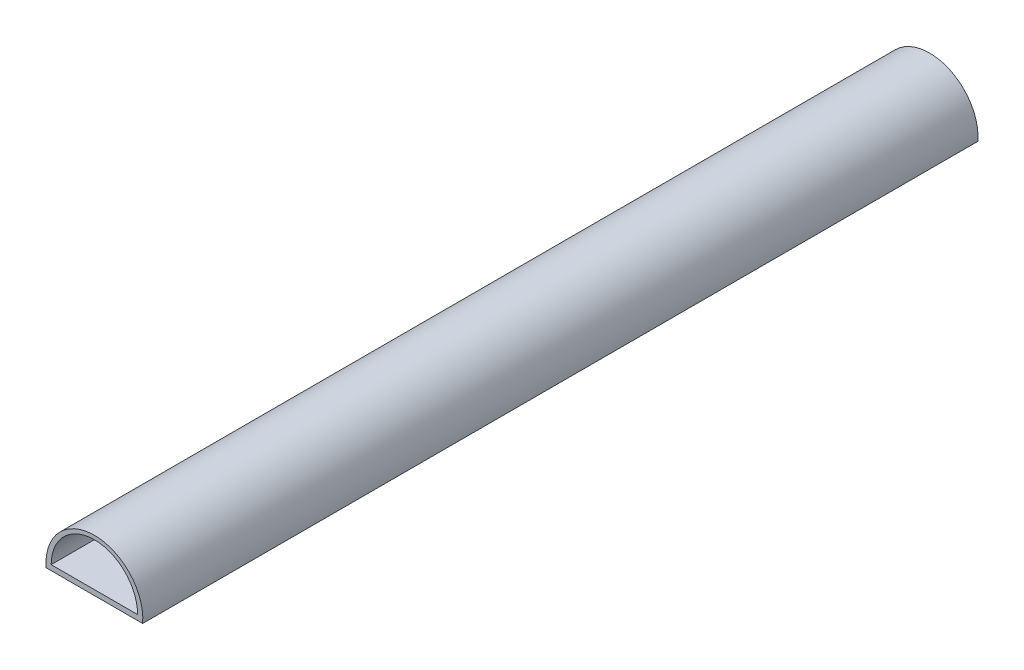
ISO-10303-21;
HEADER;
FILE_DESCRIPTION(('STEP AP214'),'2;1');
FILE_NAME('part.step','',(''),(''),'','','');
FILE_SCHEMA(('AUTOMOTIVE_DESIGN { 1 0 10303 214 1 1 1 1 }'));
ENDSEC;
DATA;
#1=APPLICATION_CONTEXT('core data for automotive mechanical design processes');
#2=APPLICATION_PROTOCOL_DEFINITION('international standard','automotive_design',2000,#1);
#3=PRODUCT_CONTEXT('',#1,'mechanical');
#4=PRODUCT('Part','Part','',(#3));
#5=PRODUCT_RELATED_PRODUCT_CATEGORY('part','',(#4));
#6=PRODUCT_DEFINITION_FORMATION('','',#4);
#7=PRODUCT_DEFINITION_CONTEXT('part definition',#1,'design');
#8=PRODUCT_DEFINITION('design','',#6,#7);
#9=PRODUCT_DEFINITION_SHAPE('','',#8);
#10=(LENGTH_UNIT() NAMED_UNIT(*) SI_UNIT(.MILLI.,.METRE.));
#11=(NAMED_UNIT(*) PLANE_ANGLE_UNIT() SI_UNIT($,.RADIAN.));
#12=(NAMED_UNIT(*) SI_UNIT($,.STERADIAN.) SOLID_ANGLE_UNIT());
#13=UNCERTAINTY_MEASURE_WITH_UNIT(LENGTH_MEASURE(1.E-05),#10,'distance_accuracy_value','');
#14=(GEOMETRIC_REPRESENTATION_CONTEXT(3) GLOBAL_UNCERTAINTY_ASSIGNED_CONTEXT((#13)) GLOBAL_UNIT_ASSIGNED_CONTEXT((#10,
#11,#12)) REPRESENTATION_CONTEXT('',''));
#15=CARTESIAN_POINT('',(0.,0.,0.));
#16=DIRECTION('',(0.,0.,1.));
#17=DIRECTION('',(1.,0.,0.));
#18=AXIS2_PLACEMENT_3D('',#15,#16,#17);
#19=CARTESIAN_POINT('',(-8.42700279293845,-8.87685553456328,254.));
#20=DIRECTION('',(0.,0.,-1.));
#21=DIRECTION('',(-1.,0.,0.));
#22=AXIS2_PLACEMENT_3D('',#19,#20,#21);
#23=PLANE('',#22);
#24=CARTESIAN_POINT('',(-8.42700279293845,-8.87685553456328,254.));
#25=DIRECTION('',(0.,0.,1.));
#26=DIRECTION('',(-1.,0.,0.));
#27=AXIS2_PLACEMENT_3D('',#24,#25,#26);
#28=CIRCLE('',#27,14.7310367744908);
#29=CARTESIAN_POINT('',(6.25737220706155,-10.0484251273645,254.));
#30=VERTEX_POINT('',#29);
#31=CARTESIAN_POINT('',(-23.1113777929385,-10.0484251273645,254.));
#32=VERTEX_POINT('',#31);
#33=EDGE_CURVE('E103',#30,#32,#28,.T.);
#34=ORIENTED_EDGE('',*,*,#33,.T.);
#35=DIRECTION('',(1.,0.,0.));
#36=VECTOR('',#35,1.);
#37=CARTESIAN_POINT('',(-23.1113777929385,-10.0484251273645,254.));
#38=LINE('',#37,#36);
#39=EDGE_CURVE('E107',#32,#30,#38,.T.);
#40=ORIENTED_EDGE('',*,*,#39,.T.);
#41=EDGE_LOOP('',(#34,#40));
#42=FACE_BOUND('',#41,.T.);
#43=CARTESIAN_POINT('',(-8.42700279293845,-8.46092512736455,254.));
#44=DIRECTION('',(0.,0.,1.));
#45=DIRECTION('',(-1.,0.,0.));
#46=AXIS2_PLACEMENT_3D('',#43,#44,#45);
#47=CIRCLE('',#46,13.1445);
#48=CARTESIAN_POINT('',(4.71749720706154,-8.46092512736455,254.));
#49=VERTEX_POINT('',#48);
#50=CARTESIAN_POINT('',(-21.5715027929384,-8.46092512736455,254.));
#51=VERTEX_POINT('',#50);
#52=EDGE_CURVE('E83',#49,#51,#47,.T.);
#53=ORIENTED_EDGE('',*,*,#52,.F.);
#54=DIRECTION('',(1.,0.,0.));
#55=VECTOR('',#54,1.);
#56=CARTESIAN_POINT('',(-8.42700279293845,-8.46092512736455,254.));
#57=LINE('',#56,#55);
#58=EDGE_CURVE('E78',#51,#49,#57,.T.);
#59=ORIENTED_EDGE('',*,*,#58,.F.);
#60=EDGE_LOOP('',(#53,#59));
#61=FACE_BOUND('',#60,.T.);
#62=ADVANCED_FACE('F39',(#42,#61),#23,.F.);
#63=CARTESIAN_POINT('',(-8.42700279293845,-8.87685553456328,0.));
#64=DIRECTION('',(0.,0.,-1.));
#65=DIRECTION('',(-1.,0.,0.));
#66=AXIS2_PLACEMENT_3D('',#63,#64,#65);
#67=PLANE('',#66);
#68=CARTESIAN_POINT('',(-8.42700279293845,-8.87685553456328,0.));
#69=DIRECTION('',(0.,0.,1.));
#70=DIRECTION('',(-1.,0.,0.));
#71=AXIS2_PLACEMENT_3D('',#68,#69,#70);
#72=CIRCLE('',#71,14.7310367744908);
#73=CARTESIAN_POINT('',(6.25737220706155,-10.0484251273645,0.));
#74=VERTEX_POINT('',#73);
#75=CARTESIAN_POINT('',(-23.1113777929385,-10.0484251273645,0.));
#76=VERTEX_POINT('',#75);
#77=EDGE_CURVE('E92',#74,#76,#72,.T.);
#78=ORIENTED_EDGE('',*,*,#77,.F.);
#79=DIRECTION('',(1.,0.,0.));
#80=VECTOR('',#79,1.);
#81=CARTESIAN_POINT('',(-23.1113777929385,-10.0484251273645,0.));
#82=LINE('',#81,#80);
#83=EDGE_CURVE('E108',#76,#74,#82,.T.);
#84=ORIENTED_EDGE('',*,*,#83,.F.);
#85=EDGE_LOOP('',(#78,#84));
#86=FACE_BOUND('',#85,.T.);
#87=DIRECTION('',(1.,0.,0.));
#88=VECTOR('',#87,1.);
#89=CARTESIAN_POINT('',(-8.42700279293845,-8.46092512736455,0.));
#90=LINE('',#89,#88);
#91=CARTESIAN_POINT('',(-21.5715027929384,-8.46092512736455,0.));
#92=VERTEX_POINT('',#91);
#93=CARTESIAN_POINT('',(4.71749720706154,-8.46092512736455,0.));
#94=VERTEX_POINT('',#93);
#95=EDGE_CURVE('E84',#92,#94,#90,.T.);
#96=ORIENTED_EDGE('',*,*,#95,.T.);
#97=CARTESIAN_POINT('',(-8.42700279293845,-8.46092512736455,0.));
#98=DIRECTION('',(0.,0.,1.));
#99=DIRECTION('',(-1.,0.,0.));
#100=AXIS2_PLACEMENT_3D('',#97,#98,#99);
#101=CIRCLE('',#100,13.1445);
#102=EDGE_CURVE('E89',#94,#92,#101,.T.);
#103=ORIENTED_EDGE('',*,*,#102,.T.);
#104=EDGE_LOOP('',(#96,#103));
#105=FACE_BOUND('',#104,.T.);
#106=ADVANCED_FACE('F124',(#86,#105),#67,.T.);
#107=CARTESIAN_POINT('',(-8.42700279293845,-8.87685553456328,254.));
#108=DIRECTION('',(0.,0.,-1.));
#109=DIRECTION('',(-1.,0.,0.));
#110=AXIS2_PLACEMENT_3D('',#107,#108,#109);
#111=CYLINDRICAL_SURFACE('',#110,14.7310367744908);
#112=ORIENTED_EDGE('',*,*,#77,.T.);
#113=DIRECTION('',(0.,0.,-1.));
#114=VECTOR('',#113,1.);
#115=CARTESIAN_POINT('',(-23.1113777929385,-10.0484251273645,254.));
#116=LINE('',#115,#114);
#117=EDGE_CURVE('E11',#32,#76,#116,.T.);
#118=ORIENTED_EDGE('',*,*,#117,.F.);
#119=ORIENTED_EDGE('',*,*,#33,.F.);
#120=DIRECTION('',(0.,0.,-1.));
#121=VECTOR('',#120,1.);
#122=CARTESIAN_POINT('',(6.25737220706155,-10.0484251273645,254.));
#123=LINE('',#122,#121);
#124=EDGE_CURVE('E48',#30,#74,#123,.T.);
#125=ORIENTED_EDGE('',*,*,#124,.T.);
#126=EDGE_LOOP('',(#112,#118,#119,#125));
#127=FACE_BOUND('',#126,.T.);
#128=ADVANCED_FACE('F41',(#127),#111,.T.);
#129=CARTESIAN_POINT('',(-23.1113777929385,-10.0484251273645,254.));
#130=DIRECTION('',(0.,1.,0.));
#131=DIRECTION('',(0.,0.,1.));
#132=AXIS2_PLACEMENT_3D('',#129,#130,#131);
#133=PLANE('',#132);
#134=ORIENTED_EDGE('',*,*,#83,.T.);
#135=ORIENTED_EDGE('',*,*,#124,.F.);
#136=ORIENTED_EDGE('',*,*,#39,.F.);
#137=ORIENTED_EDGE('',*,*,#117,.T.);
#138=EDGE_LOOP('',(#134,#135,#136,#137));
#139=FACE_BOUND('',#138,.T.);
#140=ADVANCED_FACE('F126',(#139),#133,.F.);
#141=CARTESIAN_POINT('',(-8.42700279293845,-8.46092512736455,254.));
#142=DIRECTION('',(0.,0.,-1.));
#143=DIRECTION('',(-1.,0.,0.));
#144=AXIS2_PLACEMENT_3D('',#141,#142,#143);
#145=CYLINDRICAL_SURFACE('',#144,13.1445);
#146=ORIENTED_EDGE('',*,*,#102,.F.);
#147=DIRECTION('',(0.,0.,-1.));
#148=VECTOR('',#147,1.);
#149=CARTESIAN_POINT('',(4.71749720706154,-8.46092512736455,254.));
#150=LINE('',#149,#148);
#151=EDGE_CURVE('E60',#49,#94,#150,.T.);
#152=ORIENTED_EDGE('',*,*,#151,.F.);
#153=ORIENTED_EDGE('',*,*,#52,.T.);
#154=DIRECTION('',(0.,0.,-1.));
#155=VECTOR('',#154,1.);
#156=CARTESIAN_POINT('',(-21.5715027929384,-8.46092512736455,254.));
#157=LINE('',#156,#155);
#158=EDGE_CURVE('E55',#51,#92,#157,.T.);
#159=ORIENTED_EDGE('',*,*,#158,.T.);
#160=EDGE_LOOP('',(#146,#152,#153,#159));
#161=FACE_BOUND('',#160,.T.);
#162=ADVANCED_FACE('F87',(#161),#145,.F.);
#163=CARTESIAN_POINT('',(-8.42700279293845,-8.46092512736455,254.));
#164=DIRECTION('',(0.,1.,0.));
#165=DIRECTION('',(-1.,0.,0.));
#166=AXIS2_PLACEMENT_3D('',#163,#164,#165);
#167=PLANE('',#166);
#168=ORIENTED_EDGE('',*,*,#95,.F.);
#169=ORIENTED_EDGE('',*,*,#158,.F.);
#170=ORIENTED_EDGE('',*,*,#58,.T.);
#171=ORIENTED_EDGE('',*,*,#151,.T.);
#172=EDGE_LOOP('',(#168,#169,#170,#171));
#173=FACE_BOUND('',#172,.T.);
#174=ADVANCED_FACE('F79',(#173),#167,.T.);
#175=CLOSED_SHELL('',(#62,#106,#128,#140,#162,#174));
#176=MANIFOLD_SOLID_BREP('B2',#175);
#177=ADVANCED_BREP_SHAPE_REPRESENTATION('',(#18,#176),#14);
#178=SHAPE_DEFINITION_REPRESENTATION(#9,#177);
ENDSEC;
END-ISO-10303-21;
